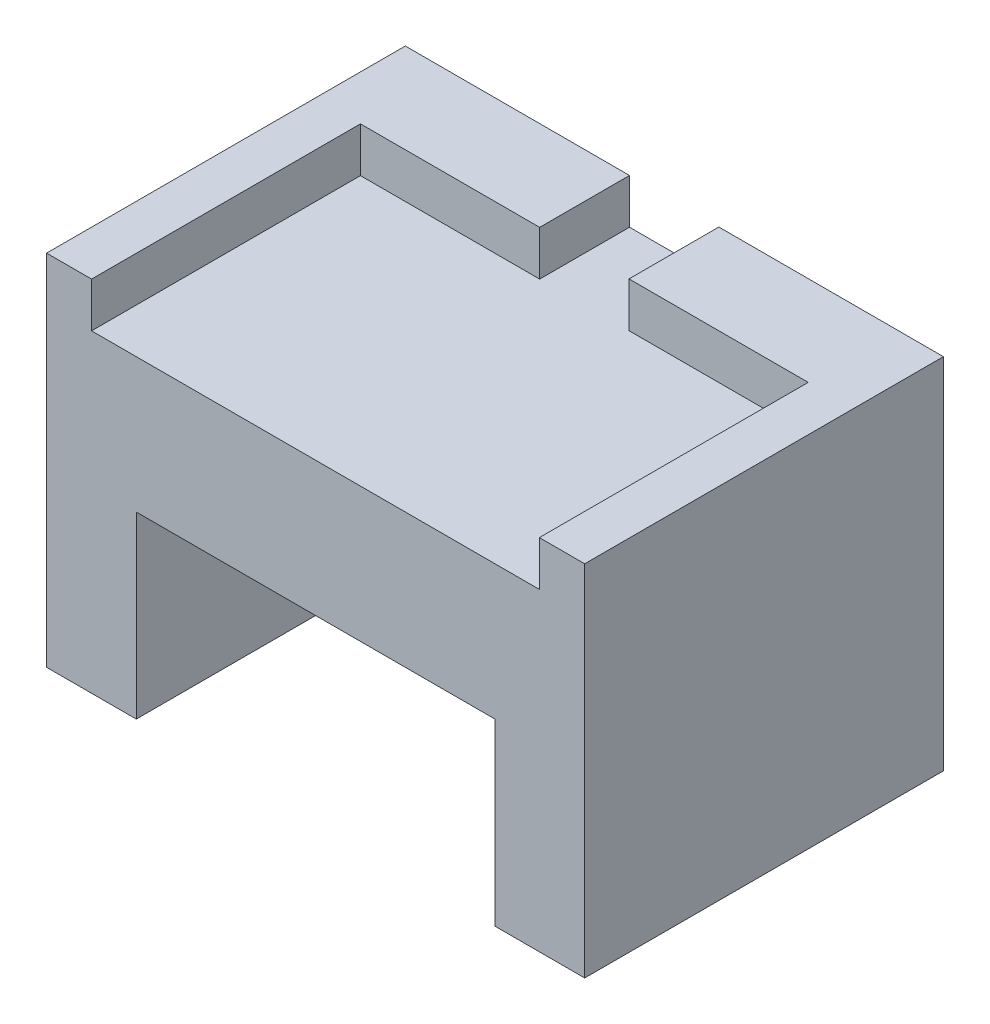
ISO-10303-21;
HEADER;
FILE_DESCRIPTION(('STEP AP214'),'2;1');
FILE_NAME('part.step','',(''),(''),'','','');
FILE_SCHEMA(('AUTOMOTIVE_DESIGN { 1 0 10303 214 1 1 1 1 }'));
ENDSEC;
DATA;
#1=APPLICATION_CONTEXT('core data for automotive mechanical design processes');
#2=APPLICATION_PROTOCOL_DEFINITION('international standard','automotive_design',2000,#1);
#3=PRODUCT_CONTEXT('',#1,'mechanical');
#4=PRODUCT('Part','Part','',(#3));
#5=PRODUCT_RELATED_PRODUCT_CATEGORY('part','',(#4));
#6=PRODUCT_DEFINITION_FORMATION('','',#4);
#7=PRODUCT_DEFINITION_CONTEXT('part definition',#1,'design');
#8=PRODUCT_DEFINITION('design','',#6,#7);
#9=PRODUCT_DEFINITION_SHAPE('','',#8);
#10=(LENGTH_UNIT() NAMED_UNIT(*) SI_UNIT(.MILLI.,.METRE.));
#11=(NAMED_UNIT(*) PLANE_ANGLE_UNIT() SI_UNIT($,.RADIAN.));
#12=(NAMED_UNIT(*) SI_UNIT($,.STERADIAN.) SOLID_ANGLE_UNIT());
#13=UNCERTAINTY_MEASURE_WITH_UNIT(LENGTH_MEASURE(1.E-05),#10,'distance_accuracy_value','');
#14=(GEOMETRIC_REPRESENTATION_CONTEXT(3) GLOBAL_UNCERTAINTY_ASSIGNED_CONTEXT((#13)) GLOBAL_UNIT_ASSIGNED_CONTEXT((#10,
#11,#12)) REPRESENTATION_CONTEXT('',''));
#15=CARTESIAN_POINT('',(0.,0.,0.));
#16=DIRECTION('',(0.,0.,1.));
#17=DIRECTION('',(1.,0.,0.));
#18=AXIS2_PLACEMENT_3D('',#15,#16,#17);
#19=CARTESIAN_POINT('',(-7.98087431693989,8.50136612021858,50.8));
#20=DIRECTION('',(0.,-1.,0.));
#21=DIRECTION('',(0.,0.,-1.));
#22=AXIS2_PLACEMENT_3D('',#19,#20,#21);
#23=PLANE('',#22);
#24=DIRECTION('',(0.,0.,-1.));
#25=VECTOR('',#24,1.);
#26=CARTESIAN_POINT('',(61.7980056830601,8.50136612021858,0.));
#27=LINE('',#26,#25);
#28=CARTESIAN_POINT('',(61.7980056830601,8.50136612021858,50.8));
#29=VERTEX_POINT('',#28);
#30=CARTESIAN_POINT('',(61.7980056830601,8.50136612021858,12.7254));
#31=VERTEX_POINT('',#30);
#32=EDGE_CURVE('E290',#29,#31,#27,.T.);
#33=ORIENTED_EDGE('',*,*,#32,.F.);
#34=DIRECTION('',(-1.,0.,0.));
#35=VECTOR('',#34,1.);
#36=CARTESIAN_POINT('',(-7.98087431693989,8.50136612021858,50.8));
#37=LINE('',#36,#35);
#38=CARTESIAN_POINT('',(68.2191256830601,8.50136612021858,50.8));
#39=VERTEX_POINT('',#38);
#40=EDGE_CURVE('E180',#39,#29,#37,.T.);
#41=ORIENTED_EDGE('',*,*,#40,.F.);
#42=DIRECTION('',(0.,0.,-1.));
#43=VECTOR('',#42,1.);
#44=CARTESIAN_POINT('',(68.2191256830601,8.50136612021858,50.8));
#45=LINE('',#44,#43);
#46=CARTESIAN_POINT('',(68.2191256830601,8.50136612021858,0.));
#47=VERTEX_POINT('',#46);
#48=EDGE_CURVE('E243',#39,#47,#45,.T.);
#49=ORIENTED_EDGE('',*,*,#48,.T.);
#50=DIRECTION('',(-1.,0.,0.));
#51=VECTOR('',#50,1.);
#52=CARTESIAN_POINT('',(-7.98087431693989,8.50136612021858,0.));
#53=LINE('',#52,#51);
#54=CARTESIAN_POINT('',(36.4183256830601,8.50136612021858,0.));
#55=VERTEX_POINT('',#54);
#56=EDGE_CURVE('E228',#47,#55,#53,.T.);
#57=ORIENTED_EDGE('',*,*,#56,.T.);
#58=DIRECTION('',(0.,0.,-1.));
#59=VECTOR('',#58,1.);
#60=CARTESIAN_POINT('',(36.4183256830601,8.50136612021858,0.));
#61=LINE('',#60,#59);
#62=CARTESIAN_POINT('',(36.4183256830601,8.50136612021858,12.7254));
#63=VERTEX_POINT('',#62);
#64=EDGE_CURVE('E291',#63,#55,#61,.T.);
#65=ORIENTED_EDGE('',*,*,#64,.F.);
#66=DIRECTION('',(1.,0.,0.));
#67=VECTOR('',#66,1.);
#68=CARTESIAN_POINT('',(0.,8.50136612021858,12.7254));
#69=LINE('',#68,#67);
#70=EDGE_CURVE('E293',#63,#31,#69,.T.);
#71=ORIENTED_EDGE('',*,*,#70,.T.);
#72=EDGE_LOOP('',(#33,#41,#49,#57,#65,#71));
#73=FACE_BOUND('',#72,.T.);
#74=ADVANCED_FACE('F39',(#73),#23,.F.);
#75=CARTESIAN_POINT('',(0.,0.,50.8));
#76=DIRECTION('',(0.,0.,1.));
#77=DIRECTION('',(1.,0.,0.));
#78=AXIS2_PLACEMENT_3D('',#75,#76,#77);
#79=PLANE('',#78);
#80=DIRECTION('',(1.,0.,0.));
#81=VECTOR('',#80,1.);
#82=CARTESIAN_POINT('',(0.,2.15136612021858,50.8));
#83=LINE('',#82,#81);
#84=CARTESIAN_POINT('',(-1.61055431693989,2.15136612021858,50.8));
#85=VERTEX_POINT('',#84);
#86=CARTESIAN_POINT('',(61.7980056830601,2.15136612021858,50.8));
#87=VERTEX_POINT('',#86);
#88=EDGE_CURVE('E161',#85,#87,#83,.T.);
#89=ORIENTED_EDGE('',*,*,#88,.F.);
#90=DIRECTION('',(0.,1.,0.));
#91=VECTOR('',#90,1.);
#92=CARTESIAN_POINT('',(-1.61055431693989,2.15136612021858,50.8));
#93=LINE('',#92,#91);
#94=CARTESIAN_POINT('',(-1.61055431693989,8.50136612021858,50.8));
#95=VERTEX_POINT('',#94);
#96=EDGE_CURVE('E209',#85,#95,#93,.T.);
#97=ORIENTED_EDGE('',*,*,#96,.T.);
#98=CARTESIAN_POINT('',(-7.98087431693989,8.50136612021858,50.8));
#99=VERTEX_POINT('',#98);
#100=EDGE_CURVE('E229',#95,#99,#37,.T.);
#101=ORIENTED_EDGE('',*,*,#100,.T.);
#102=DIRECTION('',(0.,-1.,0.));
#103=VECTOR('',#102,1.);
#104=CARTESIAN_POINT('',(-7.98087431693989,8.50136612021858,50.8));
#105=LINE('',#104,#103);
#106=CARTESIAN_POINT('',(-7.98087431693989,-42.2986338797814,50.8));
#107=VERTEX_POINT('',#106);
#108=EDGE_CURVE('E225',#99,#107,#105,.T.);
#109=ORIENTED_EDGE('',*,*,#108,.T.);
#110=DIRECTION('',(-1.,0.,0.));
#111=VECTOR('',#110,1.);
#112=CARTESIAN_POINT('',(-7.98087431693989,-42.2986338797814,50.8));
#113=LINE('',#112,#111);
#114=CARTESIAN_POINT('',(4.71912568306012,-42.2986338797814,50.8));
#115=VERTEX_POINT('',#114);
#116=EDGE_CURVE('E194',#115,#107,#113,.T.);
#117=ORIENTED_EDGE('',*,*,#116,.F.);
#118=DIRECTION('',(0.,1.,0.));
#119=VECTOR('',#118,1.);
#120=CARTESIAN_POINT('',(4.71912568306012,-42.2986338797814,50.8));
#121=LINE('',#120,#119);
#122=CARTESIAN_POINT('',(4.71912568306012,-16.8986338797814,50.8));
#123=VERTEX_POINT('',#122);
#124=EDGE_CURVE('E196',#115,#123,#121,.T.);
#125=ORIENTED_EDGE('',*,*,#124,.T.);
#126=DIRECTION('',(1.,0.,0.));
#127=VECTOR('',#126,1.);
#128=CARTESIAN_POINT('',(-7.98087431693989,-16.8986338797814,50.8));
#129=LINE('',#128,#127);
#130=CARTESIAN_POINT('',(55.5191256830601,-16.8986338797814,50.8));
#131=VERTEX_POINT('',#130);
#132=EDGE_CURVE('E223',#123,#131,#129,.T.);
#133=ORIENTED_EDGE('',*,*,#132,.T.);
#134=DIRECTION('',(0.,1.,0.));
#135=VECTOR('',#134,1.);
#136=CARTESIAN_POINT('',(55.5191256830601,-42.2986338797814,50.8));
#137=LINE('',#136,#135);
#138=CARTESIAN_POINT('',(55.5191256830601,-42.2986338797814,50.8));
#139=VERTEX_POINT('',#138);
#140=EDGE_CURVE('E203',#139,#131,#137,.T.);
#141=ORIENTED_EDGE('',*,*,#140,.F.);
#142=DIRECTION('',(-1.,0.,0.));
#143=VECTOR('',#142,1.);
#144=CARTESIAN_POINT('',(68.2191256830601,-42.2986338797814,50.8));
#145=LINE('',#144,#143);
#146=CARTESIAN_POINT('',(68.2191256830601,-42.2986338797814,50.8));
#147=VERTEX_POINT('',#146);
#148=EDGE_CURVE('E218',#147,#139,#145,.T.);
#149=ORIENTED_EDGE('',*,*,#148,.F.);
#150=DIRECTION('',(0.,1.,0.));
#151=VECTOR('',#150,1.);
#152=CARTESIAN_POINT('',(68.2191256830601,8.50136612021858,50.8));
#153=LINE('',#152,#151);
#154=EDGE_CURVE('E226',#147,#39,#153,.T.);
#155=ORIENTED_EDGE('',*,*,#154,.T.);
#156=ORIENTED_EDGE('',*,*,#40,.T.);
#157=DIRECTION('',(0.,1.,0.));
#158=VECTOR('',#157,1.);
#159=CARTESIAN_POINT('',(61.7980056830601,2.15136612021858,50.8));
#160=LINE('',#159,#158);
#161=EDGE_CURVE('E156',#87,#29,#160,.T.);
#162=ORIENTED_EDGE('',*,*,#161,.F.);
#163=EDGE_LOOP('',(#89,#97,#101,#109,#117,#125,#133,#141,#149,#155,#156,#162));
#164=FACE_BOUND('',#163,.T.);
#165=ADVANCED_FACE('F174',(#164),#79,.T.);
#166=CARTESIAN_POINT('',(-7.98087431693989,-16.8986338797814,50.8));
#167=DIRECTION('',(0.,1.,0.));
#168=DIRECTION('',(0.,0.,1.));
#169=AXIS2_PLACEMENT_3D('',#166,#167,#168);
#170=PLANE('',#169);
#171=DIRECTION('',(0.,0.,1.));
#172=VECTOR('',#171,1.);
#173=CARTESIAN_POINT('',(4.71912568306012,-16.8986338797814,50.8));
#174=LINE('',#173,#172);
#175=CARTESIAN_POINT('',(4.71912568306011,-16.8986338797814,0.));
#176=VERTEX_POINT('',#175);
#177=EDGE_CURVE('E186',#176,#123,#174,.T.);
#178=ORIENTED_EDGE('',*,*,#177,.F.);
#179=DIRECTION('',(1.,0.,0.));
#180=VECTOR('',#179,1.);
#181=CARTESIAN_POINT('',(-7.98087431693989,-16.8986338797814,0.));
#182=LINE('',#181,#180);
#183=CARTESIAN_POINT('',(55.5191256830601,-16.8986338797814,0.));
#184=VERTEX_POINT('',#183);
#185=EDGE_CURVE('E234',#176,#184,#182,.T.);
#186=ORIENTED_EDGE('',*,*,#185,.T.);
#187=DIRECTION('',(0.,0.,-1.));
#188=VECTOR('',#187,1.);
#189=CARTESIAN_POINT('',(55.5191256830601,-16.8986338797814,50.8));
#190=LINE('',#189,#188);
#191=EDGE_CURVE('E65',#131,#184,#190,.T.);
#192=ORIENTED_EDGE('',*,*,#191,.F.);
#193=ORIENTED_EDGE('',*,*,#132,.F.);
#194=EDGE_LOOP('',(#178,#186,#192,#193));
#195=FACE_BOUND('',#194,.T.);
#196=ADVANCED_FACE('F273',(#195),#170,.F.);
#197=CARTESIAN_POINT('',(-7.98087431693989,8.50136612021858,50.8));
#198=DIRECTION('',(1.,0.,0.));
#199=DIRECTION('',(0.,1.,0.));
#200=AXIS2_PLACEMENT_3D('',#197,#198,#199);
#201=PLANE('',#200);
#202=DIRECTION('',(0.,-1.,0.));
#203=VECTOR('',#202,1.);
#204=CARTESIAN_POINT('',(-7.98087431693989,8.50136612021858,0.));
#205=LINE('',#204,#203);
#206=CARTESIAN_POINT('',(-7.98087431693989,8.50136612021858,0.));
#207=VERTEX_POINT('',#206);
#208=CARTESIAN_POINT('',(-7.98087431693989,-42.2986338797814,0.));
#209=VERTEX_POINT('',#208);
#210=EDGE_CURVE('E201',#207,#209,#205,.T.);
#211=ORIENTED_EDGE('',*,*,#210,.T.);
#212=DIRECTION('',(0.,0.,-1.));
#213=VECTOR('',#212,1.);
#214=CARTESIAN_POINT('',(-7.98087431693989,-42.2986338797814,50.8));
#215=LINE('',#214,#213);
#216=EDGE_CURVE('E184',#107,#209,#215,.T.);
#217=ORIENTED_EDGE('',*,*,#216,.F.);
#218=ORIENTED_EDGE('',*,*,#108,.F.);
#219=DIRECTION('',(0.,0.,-1.));
#220=VECTOR('',#219,1.);
#221=CARTESIAN_POINT('',(-7.98087431693989,8.50136612021858,50.8));
#222=LINE('',#221,#220);
#223=EDGE_CURVE('E235',#99,#207,#222,.T.);
#224=ORIENTED_EDGE('',*,*,#223,.T.);
#225=EDGE_LOOP('',(#211,#217,#218,#224));
#226=FACE_BOUND('',#225,.T.);
#227=ADVANCED_FACE('F41',(#226),#201,.F.);
#228=CARTESIAN_POINT('',(68.2191256830601,8.50136612021858,50.8));
#229=DIRECTION('',(-1.,0.,0.));
#230=DIRECTION('',(0.,0.,1.));
#231=AXIS2_PLACEMENT_3D('',#228,#229,#230);
#232=PLANE('',#231);
#233=DIRECTION('',(0.,1.,0.));
#234=VECTOR('',#233,1.);
#235=CARTESIAN_POINT('',(68.2191256830601,8.50136612021858,0.));
#236=LINE('',#235,#234);
#237=CARTESIAN_POINT('',(68.2191256830601,-42.2986338797814,0.));
#238=VERTEX_POINT('',#237);
#239=EDGE_CURVE('E236',#238,#47,#236,.T.);
#240=ORIENTED_EDGE('',*,*,#239,.T.);
#241=ORIENTED_EDGE('',*,*,#48,.F.);
#242=ORIENTED_EDGE('',*,*,#154,.F.);
#243=DIRECTION('',(0.,0.,1.));
#244=VECTOR('',#243,1.);
#245=CARTESIAN_POINT('',(68.2191256830601,-42.2986338797814,50.8));
#246=LINE('',#245,#244);
#247=EDGE_CURVE('E211',#238,#147,#246,.T.);
#248=ORIENTED_EDGE('',*,*,#247,.F.);
#249=EDGE_LOOP('',(#240,#241,#242,#248));
#250=FACE_BOUND('',#249,.T.);
#251=ADVANCED_FACE('F283',(#250),#232,.F.);
#252=CARTESIAN_POINT('',(-1.61055431693989,8.50136612021858,12.7254));
#253=VERTEX_POINT('',#252);
#254=CARTESIAN_POINT('',(23.7691256830601,8.50136612021858,12.7254));
#255=VERTEX_POINT('',#254);
#256=EDGE_CURVE('E294',#253,#255,#69,.T.);
#257=ORIENTED_EDGE('',*,*,#256,.T.);
#258=DIRECTION('',(0.,0.,-1.));
#259=VECTOR('',#258,1.);
#260=CARTESIAN_POINT('',(23.7691256830601,8.50136612021858,0.));
#261=LINE('',#260,#259);
#262=CARTESIAN_POINT('',(23.7691256830601,8.50136612021858,0.));
#263=VERTEX_POINT('',#262);
#264=EDGE_CURVE('E299',#255,#263,#261,.T.);
#265=ORIENTED_EDGE('',*,*,#264,.T.);
#266=EDGE_CURVE('E238',#263,#207,#53,.T.);
#267=ORIENTED_EDGE('',*,*,#266,.T.);
#268=ORIENTED_EDGE('',*,*,#223,.F.);
#269=ORIENTED_EDGE('',*,*,#100,.F.);
#270=DIRECTION('',(0.,0.,-1.));
#271=VECTOR('',#270,1.);
#272=CARTESIAN_POINT('',(-1.61055431693989,8.50136612021858,0.));
#273=LINE('',#272,#271);
#274=EDGE_CURVE('E175',#95,#253,#273,.T.);
#275=ORIENTED_EDGE('',*,*,#274,.T.);
#276=EDGE_LOOP('',(#257,#265,#267,#268,#269,#275));
#277=FACE_BOUND('',#276,.T.);
#278=ADVANCED_FACE('F331',(#277),#23,.F.);
#279=CARTESIAN_POINT('',(0.,0.,0.));
#280=DIRECTION('',(0.,0.,1.));
#281=DIRECTION('',(1.,0.,0.));
#282=AXIS2_PLACEMENT_3D('',#279,#280,#281);
#283=PLANE('',#282);
#284=DIRECTION('',(-1.,0.,0.));
#285=VECTOR('',#284,1.);
#286=CARTESIAN_POINT('',(0.,2.15136612021858,0.));
#287=LINE('',#286,#285);
#288=CARTESIAN_POINT('',(36.4183256830601,2.15136612021858,0.));
#289=VERTEX_POINT('',#288);
#290=CARTESIAN_POINT('',(23.7691256830601,2.15136612021858,0.));
#291=VERTEX_POINT('',#290);
#292=EDGE_CURVE('E319',#289,#291,#287,.T.);
#293=ORIENTED_EDGE('',*,*,#292,.F.);
#294=DIRECTION('',(0.,1.,0.));
#295=VECTOR('',#294,1.);
#296=CARTESIAN_POINT('',(36.4183256830601,2.15136612021858,0.));
#297=LINE('',#296,#295);
#298=EDGE_CURVE('E311',#289,#55,#297,.T.);
#299=ORIENTED_EDGE('',*,*,#298,.T.);
#300=ORIENTED_EDGE('',*,*,#56,.F.);
#301=ORIENTED_EDGE('',*,*,#239,.F.);
#302=DIRECTION('',(1.,0.,0.));
#303=VECTOR('',#302,1.);
#304=CARTESIAN_POINT('',(68.2191256830601,-42.2986338797814,0.));
#305=LINE('',#304,#303);
#306=CARTESIAN_POINT('',(55.5191256830601,-42.2986338797814,0.));
#307=VERTEX_POINT('',#306);
#308=EDGE_CURVE('E215',#307,#238,#305,.T.);
#309=ORIENTED_EDGE('',*,*,#308,.F.);
#310=DIRECTION('',(0.,1.,0.));
#311=VECTOR('',#310,1.);
#312=CARTESIAN_POINT('',(55.5191256830601,-42.2986338797814,0.));
#313=LINE('',#312,#311);
#314=EDGE_CURVE('E206',#307,#184,#313,.T.);
#315=ORIENTED_EDGE('',*,*,#314,.T.);
#316=ORIENTED_EDGE('',*,*,#185,.F.);
#317=DIRECTION('',(0.,1.,0.));
#318=VECTOR('',#317,1.);
#319=CARTESIAN_POINT('',(4.71912568306011,-42.2986338797814,0.));
#320=LINE('',#319,#318);
#321=CARTESIAN_POINT('',(4.71912568306011,-42.2986338797814,0.));
#322=VERTEX_POINT('',#321);
#323=EDGE_CURVE('E202',#322,#176,#320,.T.);
#324=ORIENTED_EDGE('',*,*,#323,.F.);
#325=DIRECTION('',(1.,0.,0.));
#326=VECTOR('',#325,1.);
#327=CARTESIAN_POINT('',(-7.98087431693989,-42.2986338797814,0.));
#328=LINE('',#327,#326);
#329=EDGE_CURVE('E189',#209,#322,#328,.T.);
#330=ORIENTED_EDGE('',*,*,#329,.F.);
#331=ORIENTED_EDGE('',*,*,#210,.F.);
#332=ORIENTED_EDGE('',*,*,#266,.F.);
#333=DIRECTION('',(0.,1.,0.));
#334=VECTOR('',#333,1.);
#335=CARTESIAN_POINT('',(23.7691256830601,2.15136612021858,0.));
#336=LINE('',#335,#334);
#337=EDGE_CURVE('E307',#291,#263,#336,.T.);
#338=ORIENTED_EDGE('',*,*,#337,.F.);
#339=EDGE_LOOP('',(#293,#299,#300,#301,#309,#315,#316,#324,#330,#331,#332,#338));
#340=FACE_BOUND('',#339,.T.);
#341=ADVANCED_FACE('F275',(#340),#283,.F.);
#342=CARTESIAN_POINT('',(55.5191256830601,-42.2986338797814,50.8));
#343=DIRECTION('',(1.,0.,0.));
#344=DIRECTION('',(0.,1.,0.));
#345=AXIS2_PLACEMENT_3D('',#342,#343,#344);
#346=PLANE('',#345);
#347=CARTESIAN_POINT('',(55.5191256830601,-29.5986338797814,25.4));
#348=DIRECTION('',(1.,0.,0.));
#349=DIRECTION('',(0.,1.,0.));
#350=AXIS2_PLACEMENT_3D('',#347,#348,#349);
#351=CIRCLE('',#350,6.35);
#352=CARTESIAN_POINT('',(55.5191256830601,-23.2486338797814,25.4));
#353=VERTEX_POINT('',#352);
#354=EDGE_CURVE('E11',#353,#353,#351,.F.);
#355=ORIENTED_EDGE('',*,*,#354,.F.);
#356=EDGE_LOOP('',(#355));
#357=FACE_BOUND('',#356,.T.);
#358=ORIENTED_EDGE('',*,*,#191,.T.);
#359=ORIENTED_EDGE('',*,*,#314,.F.);
#360=DIRECTION('',(0.,0.,-1.));
#361=VECTOR('',#360,1.);
#362=CARTESIAN_POINT('',(55.5191256830601,-42.2986338797814,50.8));
#363=LINE('',#362,#361);
#364=EDGE_CURVE('E217',#139,#307,#363,.T.);
#365=ORIENTED_EDGE('',*,*,#364,.F.);
#366=ORIENTED_EDGE('',*,*,#140,.T.);
#367=EDGE_LOOP('',(#358,#359,#365,#366));
#368=FACE_BOUND('',#367,.T.);
#369=ADVANCED_FACE('F280',(#357,#368),#346,.F.);
#370=CARTESIAN_POINT('',(0.,-42.2986338797814,0.));
#371=DIRECTION('',(0.,1.,0.));
#372=DIRECTION('',(0.,0.,1.));
#373=AXIS2_PLACEMENT_3D('',#370,#371,#372);
#374=PLANE('',#373);
#375=ORIENTED_EDGE('',*,*,#247,.T.);
#376=ORIENTED_EDGE('',*,*,#148,.T.);
#377=ORIENTED_EDGE('',*,*,#364,.T.);
#378=ORIENTED_EDGE('',*,*,#308,.T.);
#379=EDGE_LOOP('',(#375,#376,#377,#378));
#380=FACE_BOUND('',#379,.T.);
#381=ADVANCED_FACE('F251',(#380),#374,.F.);
#382=CARTESIAN_POINT('',(4.71912568306012,-42.2986338797814,50.8));
#383=DIRECTION('',(-1.,0.,0.));
#384=DIRECTION('',(0.,0.,1.));
#385=AXIS2_PLACEMENT_3D('',#382,#383,#384);
#386=PLANE('',#385);
#387=CARTESIAN_POINT('',(4.71912568306011,-29.5986338797814,25.4));
#388=DIRECTION('',(-1.,0.,0.));
#389=DIRECTION('',(0.,0.,1.));
#390=AXIS2_PLACEMENT_3D('',#387,#388,#389);
#391=CIRCLE('',#390,6.35);
#392=CARTESIAN_POINT('',(4.71912568306011,-29.5986338797814,31.75));
#393=VERTEX_POINT('',#392);
#394=EDGE_CURVE('E50',#393,#393,#391,.F.);
#395=ORIENTED_EDGE('',*,*,#394,.F.);
#396=EDGE_LOOP('',(#395));
#397=FACE_BOUND('',#396,.T.);
#398=ORIENTED_EDGE('',*,*,#177,.T.);
#399=ORIENTED_EDGE('',*,*,#124,.F.);
#400=DIRECTION('',(0.,0.,1.));
#401=VECTOR('',#400,1.);
#402=CARTESIAN_POINT('',(4.71912568306012,-42.2986338797814,50.8));
#403=LINE('',#402,#401);
#404=EDGE_CURVE('E192',#322,#115,#403,.T.);
#405=ORIENTED_EDGE('',*,*,#404,.F.);
#406=ORIENTED_EDGE('',*,*,#323,.T.);
#407=EDGE_LOOP('',(#398,#399,#405,#406));
#408=FACE_BOUND('',#407,.T.);
#409=ADVANCED_FACE('F249',(#397,#408),#386,.F.);
#410=CARTESIAN_POINT('',(0.,-42.2986338797814,0.));
#411=DIRECTION('',(0.,-1.,0.));
#412=DIRECTION('',(0.,0.,-1.));
#413=AXIS2_PLACEMENT_3D('',#410,#411,#412);
#414=PLANE('',#413);
#415=ORIENTED_EDGE('',*,*,#216,.T.);
#416=ORIENTED_EDGE('',*,*,#329,.T.);
#417=ORIENTED_EDGE('',*,*,#404,.T.);
#418=ORIENTED_EDGE('',*,*,#116,.T.);
#419=EDGE_LOOP('',(#415,#416,#417,#418));
#420=FACE_BOUND('',#419,.T.);
#421=ADVANCED_FACE('F254',(#420),#414,.T.);
#422=CARTESIAN_POINT('',(55.5191256830601,-29.5986338797814,25.4));
#423=DIRECTION('',(-1.,0.,0.));
#424=DIRECTION('',(0.,0.,1.));
#425=AXIS2_PLACEMENT_3D('',#422,#423,#424);
#426=CYLINDRICAL_SURFACE('',#425,6.35);
#427=ORIENTED_EDGE('',*,*,#354,.T.);
#428=EDGE_LOOP('',(#427));
#429=FACE_BOUND('',#428,.T.);
#430=ORIENTED_EDGE('',*,*,#394,.T.);
#431=EDGE_LOOP('',(#430));
#432=FACE_BOUND('',#431,.T.);
#433=ADVANCED_FACE('F247',(#429,#432),#426,.T.);
#434=CARTESIAN_POINT('',(-1.61055431693989,2.15136612021858,0.));
#435=DIRECTION('',(1.,0.,0.));
#436=DIRECTION('',(0.,0.,-1.));
#437=AXIS2_PLACEMENT_3D('',#434,#435,#436);
#438=PLANE('',#437);
#439=ORIENTED_EDGE('',*,*,#274,.F.);
#440=ORIENTED_EDGE('',*,*,#96,.F.);
#441=DIRECTION('',(0.,0.,-1.));
#442=VECTOR('',#441,1.);
#443=CARTESIAN_POINT('',(-1.61055431693989,2.15136612021858,0.));
#444=LINE('',#443,#442);
#445=CARTESIAN_POINT('',(-1.61055431693989,2.15136612021858,12.7254));
#446=VERTEX_POINT('',#445);
#447=EDGE_CURVE('E169',#85,#446,#444,.T.);
#448=ORIENTED_EDGE('',*,*,#447,.T.);
#449=DIRECTION('',(0.,1.,0.));
#450=VECTOR('',#449,1.);
#451=CARTESIAN_POINT('',(-1.61055431693989,2.15136612021858,12.7254));
#452=LINE('',#451,#450);
#453=EDGE_CURVE('E304',#446,#253,#452,.T.);
#454=ORIENTED_EDGE('',*,*,#453,.T.);
#455=EDGE_LOOP('',(#439,#440,#448,#454));
#456=FACE_BOUND('',#455,.T.);
#457=ADVANCED_FACE('F340',(#456),#438,.T.);
#458=CARTESIAN_POINT('',(0.,2.15136612021858,12.7254));
#459=DIRECTION('',(0.,0.,1.));
#460=DIRECTION('',(1.,0.,0.));
#461=AXIS2_PLACEMENT_3D('',#458,#459,#460);
#462=PLANE('',#461);
#463=ORIENTED_EDGE('',*,*,#256,.F.);
#464=ORIENTED_EDGE('',*,*,#453,.F.);
#465=DIRECTION('',(1.,0.,0.));
#466=VECTOR('',#465,1.);
#467=CARTESIAN_POINT('',(0.,2.15136612021858,12.7254));
#468=LINE('',#467,#466);
#469=CARTESIAN_POINT('',(23.7691256830601,2.15136612021858,12.7254));
#470=VERTEX_POINT('',#469);
#471=EDGE_CURVE('E181',#446,#470,#468,.T.);
#472=ORIENTED_EDGE('',*,*,#471,.T.);
#473=DIRECTION('',(0.,1.,0.));
#474=VECTOR('',#473,1.);
#475=CARTESIAN_POINT('',(23.7691256830601,2.15136612021858,12.7254));
#476=LINE('',#475,#474);
#477=EDGE_CURVE('E310',#470,#255,#476,.T.);
#478=ORIENTED_EDGE('',*,*,#477,.T.);
#479=EDGE_LOOP('',(#463,#464,#472,#478));
#480=FACE_BOUND('',#479,.T.);
#481=ADVANCED_FACE('F329',(#480),#462,.T.);
#482=CARTESIAN_POINT('',(23.7691256830601,2.15136612021858,0.));
#483=DIRECTION('',(1.,0.,0.));
#484=DIRECTION('',(0.,0.,-1.));
#485=AXIS2_PLACEMENT_3D('',#482,#483,#484);
#486=PLANE('',#485);
#487=ORIENTED_EDGE('',*,*,#264,.F.);
#488=ORIENTED_EDGE('',*,*,#477,.F.);
#489=DIRECTION('',(0.,0.,-1.));
#490=VECTOR('',#489,1.);
#491=CARTESIAN_POINT('',(23.7691256830601,2.15136612021858,0.));
#492=LINE('',#491,#490);
#493=EDGE_CURVE('E318',#470,#291,#492,.T.);
#494=ORIENTED_EDGE('',*,*,#493,.T.);
#495=ORIENTED_EDGE('',*,*,#337,.T.);
#496=EDGE_LOOP('',(#487,#488,#494,#495));
#497=FACE_BOUND('',#496,.T.);
#498=ADVANCED_FACE('F332',(#497),#486,.T.);
#499=CARTESIAN_POINT('',(36.4183256830601,2.15136612021858,0.));
#500=DIRECTION('',(1.,0.,0.));
#501=DIRECTION('',(0.,0.,-1.));
#502=AXIS2_PLACEMENT_3D('',#499,#500,#501);
#503=PLANE('',#502);
#504=ORIENTED_EDGE('',*,*,#64,.T.);
#505=ORIENTED_EDGE('',*,*,#298,.F.);
#506=DIRECTION('',(0.,0.,-1.));
#507=VECTOR('',#506,1.);
#508=CARTESIAN_POINT('',(36.4183256830601,2.15136612021858,0.));
#509=LINE('',#508,#507);
#510=CARTESIAN_POINT('',(36.4183256830601,2.15136612021858,12.7254));
#511=VERTEX_POINT('',#510);
#512=EDGE_CURVE('E53',#511,#289,#509,.T.);
#513=ORIENTED_EDGE('',*,*,#512,.F.);
#514=DIRECTION('',(0.,1.,0.));
#515=VECTOR('',#514,1.);
#516=CARTESIAN_POINT('',(36.4183256830601,2.15136612021858,12.7254));
#517=LINE('',#516,#515);
#518=EDGE_CURVE('E177',#511,#63,#517,.T.);
#519=ORIENTED_EDGE('',*,*,#518,.T.);
#520=EDGE_LOOP('',(#504,#505,#513,#519));
#521=FACE_BOUND('',#520,.T.);
#522=ADVANCED_FACE('F313',(#521),#503,.F.);
#523=ORIENTED_EDGE('',*,*,#70,.F.);
#524=ORIENTED_EDGE('',*,*,#518,.F.);
#525=CARTESIAN_POINT('',(61.7980056830601,2.15136612021858,12.7254));
#526=VERTEX_POINT('',#525);
#527=EDGE_CURVE('E162',#511,#526,#468,.T.);
#528=ORIENTED_EDGE('',*,*,#527,.T.);
#529=DIRECTION('',(0.,1.,0.));
#530=VECTOR('',#529,1.);
#531=CARTESIAN_POINT('',(61.7980056830601,2.15136612021858,12.7254));
#532=LINE('',#531,#530);
#533=EDGE_CURVE('E163',#526,#31,#532,.T.);
#534=ORIENTED_EDGE('',*,*,#533,.T.);
#535=EDGE_LOOP('',(#523,#524,#528,#534));
#536=FACE_BOUND('',#535,.T.);
#537=ADVANCED_FACE('F317',(#536),#462,.T.);
#538=CARTESIAN_POINT('',(61.7980056830601,2.15136612021858,0.));
#539=DIRECTION('',(1.,0.,0.));
#540=DIRECTION('',(0.,0.,-1.));
#541=AXIS2_PLACEMENT_3D('',#538,#539,#540);
#542=PLANE('',#541);
#543=ORIENTED_EDGE('',*,*,#32,.T.);
#544=ORIENTED_EDGE('',*,*,#533,.F.);
#545=DIRECTION('',(0.,0.,-1.));
#546=VECTOR('',#545,1.);
#547=CARTESIAN_POINT('',(61.7980056830601,2.15136612021858,0.));
#548=LINE('',#547,#546);
#549=EDGE_CURVE('E153',#87,#526,#548,.T.);
#550=ORIENTED_EDGE('',*,*,#549,.F.);
#551=ORIENTED_EDGE('',*,*,#161,.T.);
#552=EDGE_LOOP('',(#543,#544,#550,#551));
#553=FACE_BOUND('',#552,.T.);
#554=ADVANCED_FACE('F159',(#553),#542,.F.);
#555=CARTESIAN_POINT('',(0.,2.15136612021858,0.));
#556=DIRECTION('',(0.,1.,0.));
#557=DIRECTION('',(0.,0.,1.));
#558=AXIS2_PLACEMENT_3D('',#555,#556,#557);
#559=PLANE('',#558);
#560=ORIENTED_EDGE('',*,*,#88,.T.);
#561=ORIENTED_EDGE('',*,*,#549,.T.);
#562=ORIENTED_EDGE('',*,*,#527,.F.);
#563=ORIENTED_EDGE('',*,*,#512,.T.);
#564=ORIENTED_EDGE('',*,*,#292,.T.);
#565=ORIENTED_EDGE('',*,*,#493,.F.);
#566=ORIENTED_EDGE('',*,*,#471,.F.);
#567=ORIENTED_EDGE('',*,*,#447,.F.);
#568=EDGE_LOOP('',(#560,#561,#562,#563,#564,#565,#566,#567));
#569=FACE_BOUND('',#568,.T.);
#570=ADVANCED_FACE('F170',(#569),#559,.T.);
#571=CLOSED_SHELL('',(#74,#165,#196,#227,#251,#278,#341,#369,#381,#409,#421,#433,#457,#481,#498,
#522,#537,#554,#570));
#572=MANIFOLD_SOLID_BREP('B2',#571);
#573=ADVANCED_BREP_SHAPE_REPRESENTATION('',(#18,#572),#14);
#574=SHAPE_DEFINITION_REPRESENTATION(#9,#573);
ENDSEC;
END-ISO-10303-21;
